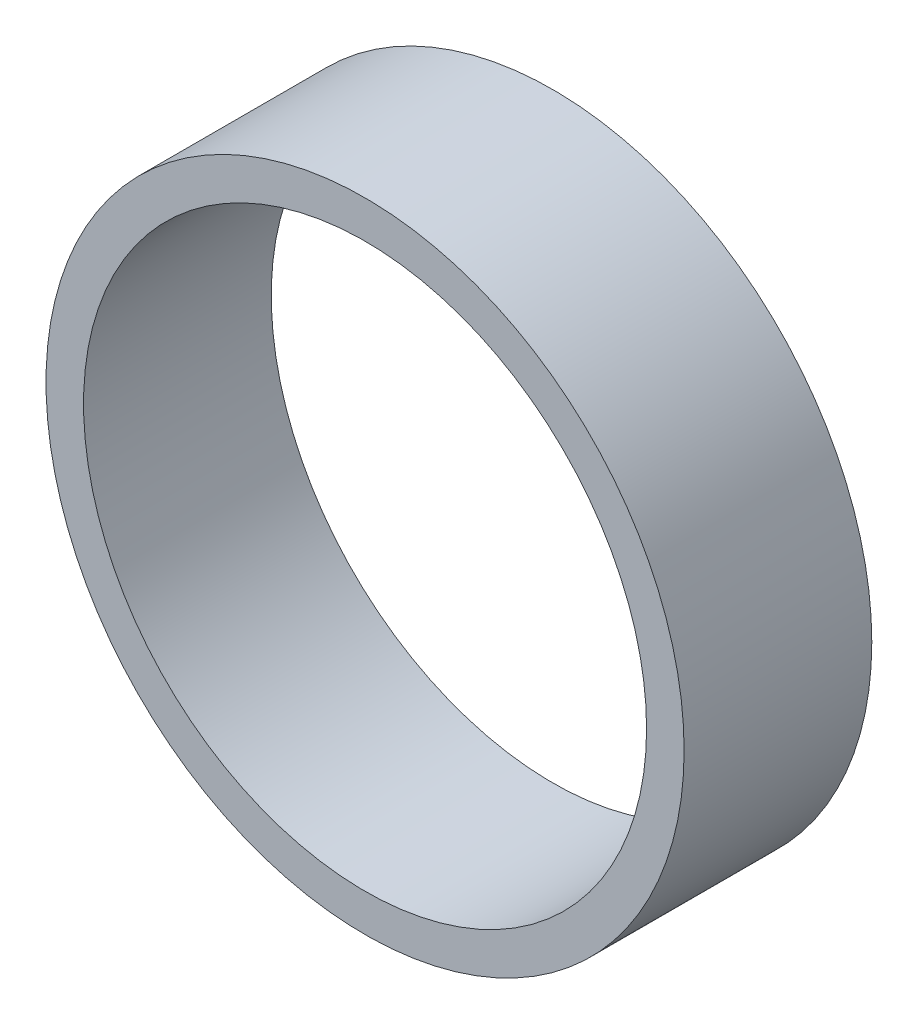
ISO-10303-21;
HEADER;
FILE_DESCRIPTION(('STEP AP214'),'2;1');
FILE_NAME('part.step','',(''),(''),'','','');
FILE_SCHEMA(('AUTOMOTIVE_DESIGN { 1 0 10303 214 1 1 1 1 }'));
ENDSEC;
DATA;
#1=APPLICATION_CONTEXT('core data for automotive mechanical design processes');
#2=APPLICATION_PROTOCOL_DEFINITION('international standard','automotive_design',2000,#1);
#3=PRODUCT_CONTEXT('',#1,'mechanical');
#4=PRODUCT('Part','Part','',(#3));
#5=PRODUCT_RELATED_PRODUCT_CATEGORY('part','',(#4));
#6=PRODUCT_DEFINITION_FORMATION('','',#4);
#7=PRODUCT_DEFINITION_CONTEXT('part definition',#1,'design');
#8=PRODUCT_DEFINITION('design','',#6,#7);
#9=PRODUCT_DEFINITION_SHAPE('','',#8);
#10=(LENGTH_UNIT() NAMED_UNIT(*) SI_UNIT(.MILLI.,.METRE.));
#11=(NAMED_UNIT(*) PLANE_ANGLE_UNIT() SI_UNIT($,.RADIAN.));
#12=(NAMED_UNIT(*) SI_UNIT($,.STERADIAN.) SOLID_ANGLE_UNIT());
#13=UNCERTAINTY_MEASURE_WITH_UNIT(LENGTH_MEASURE(1.E-05),#10,'distance_accuracy_value','');
#14=(GEOMETRIC_REPRESENTATION_CONTEXT(3) GLOBAL_UNCERTAINTY_ASSIGNED_CONTEXT((#13)) GLOBAL_UNIT_ASSIGNED_CONTEXT((#10,
#11,#12)) REPRESENTATION_CONTEXT('',''));
#15=CARTESIAN_POINT('',(0.,0.,0.));
#16=DIRECTION('',(0.,0.,1.));
#17=DIRECTION('',(1.,0.,0.));
#18=AXIS2_PLACEMENT_3D('',#15,#16,#17);
#19=CARTESIAN_POINT('',(0.,0.,10.));
#20=DIRECTION('',(0.,0.,1.));
#21=DIRECTION('',(1.,0.,0.));
#22=AXIS2_PLACEMENT_3D('',#19,#20,#21);
#23=PLANE('',#22);
#24=CARTESIAN_POINT('',(0.,0.,10.));
#25=DIRECTION('',(0.,0.,1.));
#26=DIRECTION('',(1.,0.,0.));
#27=AXIS2_PLACEMENT_3D('',#24,#25,#26);
#28=CIRCLE('',#27,17.);
#29=CARTESIAN_POINT('',(17.,0.,10.));
#30=VERTEX_POINT('',#29);
#31=EDGE_CURVE('E10',#30,#30,#28,.T.);
#32=ORIENTED_EDGE('',*,*,#31,.T.);
#33=EDGE_LOOP('',(#32));
#34=FACE_BOUND('',#33,.T.);
#35=CARTESIAN_POINT('',(0.,0.,10.));
#36=DIRECTION('',(0.,0.,1.));
#37=DIRECTION('',(1.,0.,0.));
#38=AXIS2_PLACEMENT_3D('',#35,#36,#37);
#39=CIRCLE('',#38,15.);
#40=CARTESIAN_POINT('',(15.,0.,10.));
#41=VERTEX_POINT('',#40);
#42=EDGE_CURVE('E42',#41,#41,#39,.T.);
#43=ORIENTED_EDGE('',*,*,#42,.F.);
#44=EDGE_LOOP('',(#43));
#45=FACE_BOUND('',#44,.T.);
#46=ADVANCED_FACE('F31',(#34,#45),#23,.T.);
#47=CARTESIAN_POINT('',(0.,0.,0.));
#48=DIRECTION('',(0.,0.,1.));
#49=DIRECTION('',(1.,0.,0.));
#50=AXIS2_PLACEMENT_3D('',#47,#48,#49);
#51=PLANE('',#50);
#52=CARTESIAN_POINT('',(0.,0.,0.));
#53=DIRECTION('',(0.,0.,1.));
#54=DIRECTION('',(1.,0.,0.));
#55=AXIS2_PLACEMENT_3D('',#52,#53,#54);
#56=CIRCLE('',#55,17.);
#57=CARTESIAN_POINT('',(17.,0.,0.));
#58=VERTEX_POINT('',#57);
#59=EDGE_CURVE('E35',#58,#58,#56,.T.);
#60=ORIENTED_EDGE('',*,*,#59,.F.);
#61=EDGE_LOOP('',(#60));
#62=FACE_BOUND('',#61,.T.);
#63=CARTESIAN_POINT('',(0.,0.,0.));
#64=DIRECTION('',(0.,0.,1.));
#65=DIRECTION('',(1.,0.,0.));
#66=AXIS2_PLACEMENT_3D('',#63,#64,#65);
#67=CIRCLE('',#66,15.);
#68=CARTESIAN_POINT('',(15.,0.,0.));
#69=VERTEX_POINT('',#68);
#70=EDGE_CURVE('E44',#69,#69,#67,.T.);
#71=ORIENTED_EDGE('',*,*,#70,.T.);
#72=EDGE_LOOP('',(#71));
#73=FACE_BOUND('',#72,.T.);
#74=ADVANCED_FACE('F54',(#62,#73),#51,.F.);
#75=CARTESIAN_POINT('',(0.,0.,10.));
#76=DIRECTION('',(0.,0.,-1.));
#77=DIRECTION('',(-1.,0.,0.));
#78=AXIS2_PLACEMENT_3D('',#75,#76,#77);
#79=CYLINDRICAL_SURFACE('',#78,17.);
#80=ORIENTED_EDGE('',*,*,#31,.F.);
#81=EDGE_LOOP('',(#80));
#82=FACE_BOUND('',#81,.T.);
#83=ORIENTED_EDGE('',*,*,#59,.T.);
#84=EDGE_LOOP('',(#83));
#85=FACE_BOUND('',#84,.T.);
#86=ADVANCED_FACE('F33',(#82,#85),#79,.T.);
#87=CARTESIAN_POINT('',(0.,0.,10.));
#88=DIRECTION('',(0.,0.,-1.));
#89=DIRECTION('',(-1.,0.,0.));
#90=AXIS2_PLACEMENT_3D('',#87,#88,#89);
#91=CYLINDRICAL_SURFACE('',#90,15.);
#92=ORIENTED_EDGE('',*,*,#42,.T.);
#93=EDGE_LOOP('',(#92));
#94=FACE_BOUND('',#93,.T.);
#95=ORIENTED_EDGE('',*,*,#70,.F.);
#96=EDGE_LOOP('',(#95));
#97=FACE_BOUND('',#96,.T.);
#98=ADVANCED_FACE('F50',(#94,#97),#91,.F.);
#99=CLOSED_SHELL('',(#46,#74,#86,#98));
#100=MANIFOLD_SOLID_BREP('B2',#99);
#101=ADVANCED_BREP_SHAPE_REPRESENTATION('',(#18,#100),#14);
#102=SHAPE_DEFINITION_REPRESENTATION(#9,#101);
ENDSEC;
END-ISO-10303-21;
